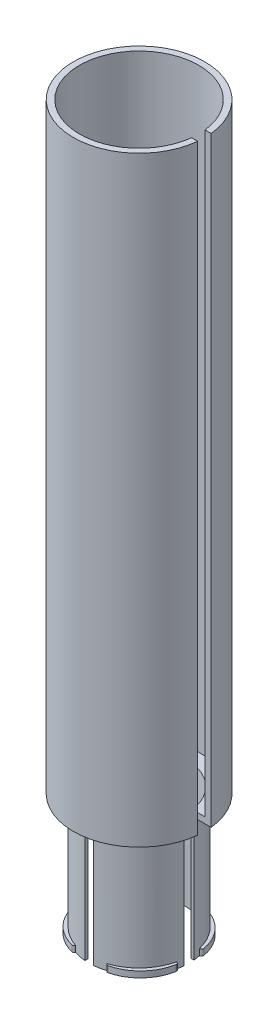
ISO-10303-21;
HEADER;
FILE_DESCRIPTION(('STEP AP214'),'2;1');
FILE_NAME('part.step','',(''),(''),'','','');
FILE_SCHEMA(('AUTOMOTIVE_DESIGN { 1 0 10303 214 1 1 1 1 }'));
ENDSEC;
DATA;
#1=APPLICATION_CONTEXT('core data for automotive mechanical design processes');
#2=APPLICATION_PROTOCOL_DEFINITION('international standard','automotive_design',2000,#1);
#3=PRODUCT_CONTEXT('',#1,'mechanical');
#4=PRODUCT('Part','Part','',(#3));
#5=PRODUCT_RELATED_PRODUCT_CATEGORY('part','',(#4));
#6=PRODUCT_DEFINITION_FORMATION('','',#4);
#7=PRODUCT_DEFINITION_CONTEXT('part definition',#1,'design');
#8=PRODUCT_DEFINITION('design','',#6,#7);
#9=PRODUCT_DEFINITION_SHAPE('','',#8);
#10=(LENGTH_UNIT() NAMED_UNIT(*) SI_UNIT(.MILLI.,.METRE.));
#11=(NAMED_UNIT(*) PLANE_ANGLE_UNIT() SI_UNIT($,.RADIAN.));
#12=(NAMED_UNIT(*) SI_UNIT($,.STERADIAN.) SOLID_ANGLE_UNIT());
#13=UNCERTAINTY_MEASURE_WITH_UNIT(LENGTH_MEASURE(1.E-05),#10,'distance_accuracy_value','');
#14=(GEOMETRIC_REPRESENTATION_CONTEXT(3) GLOBAL_UNCERTAINTY_ASSIGNED_CONTEXT((#13)) GLOBAL_UNIT_ASSIGNED_CONTEXT((#10,
#11,#12)) REPRESENTATION_CONTEXT('',''));
#15=CARTESIAN_POINT('',(0.,0.,0.));
#16=DIRECTION('',(0.,0.,1.));
#17=DIRECTION('',(1.,0.,0.));
#18=AXIS2_PLACEMENT_3D('',#15,#16,#17);
#19=CARTESIAN_POINT('',(0.,200.,0.));
#20=DIRECTION('',(0.,-1.,0.));
#21=DIRECTION('',(0.,0.,-1.));
#22=AXIS2_PLACEMENT_3D('',#19,#20,#21);
#23=CYLINDRICAL_SURFACE('',#22,19.59);
#24=DIRECTION('',(0.,-1.,0.));
#25=VECTOR('',#24,1.);
#26=CARTESIAN_POINT('',(19.4644896015333,200.,-2.21398838113535));
#27=LINE('',#26,#25);
#28=CARTESIAN_POINT('',(19.4644896015333,197.5,-2.21398838113535));
#29=VERTEX_POINT('',#28);
#30=CARTESIAN_POINT('',(19.4644896015333,2.,-2.21398838113535));
#31=VERTEX_POINT('',#30);
#32=EDGE_CURVE('E514',#29,#31,#27,.T.);
#33=ORIENTED_EDGE('',*,*,#32,.F.);
#34=CARTESIAN_POINT('',(0.,197.5,0.));
#35=DIRECTION('',(0.,1.,0.));
#36=DIRECTION('',(0.,0.,1.));
#37=AXIS2_PLACEMENT_3D('',#34,#35,#36);
#38=CIRCLE('',#37,19.59);
#39=CARTESIAN_POINT('',(19.4644896015333,197.5,2.21398838113535));
#40=VERTEX_POINT('',#39);
#41=EDGE_CURVE('E292',#29,#40,#38,.T.);
#42=ORIENTED_EDGE('',*,*,#41,.T.);
#43=DIRECTION('',(0.,-1.,0.));
#44=VECTOR('',#43,1.);
#45=CARTESIAN_POINT('',(19.4644896015333,200.,2.21398838113535));
#46=LINE('',#45,#44);
#47=CARTESIAN_POINT('',(19.4644896015333,2.,2.21398838113535));
#48=VERTEX_POINT('',#47);
#49=EDGE_CURVE('E289',#48,#40,#46,.F.);
#50=ORIENTED_EDGE('',*,*,#49,.F.);
#51=CARTESIAN_POINT('',(0.,2.,0.));
#52=DIRECTION('',(0.,1.,0.));
#53=DIRECTION('',(0.,0.,1.));
#54=AXIS2_PLACEMENT_3D('',#51,#52,#53);
#55=CIRCLE('',#54,19.59);
#56=EDGE_CURVE('E302',#31,#48,#55,.T.);
#57=ORIENTED_EDGE('',*,*,#56,.F.);
#58=EDGE_LOOP('',(#33,#42,#50,#57));
#59=FACE_BOUND('',#58,.T.);
#60=ADVANCED_FACE('F47',(#59),#23,.F.);
#61=CARTESIAN_POINT('',(15.,104.269834735047,2.21398838113535));
#62=DIRECTION('',(0.,0.,1.));
#63=DIRECTION('',(1.,0.,0.));
#64=AXIS2_PLACEMENT_3D('',#61,#62,#63);
#65=PLANE('',#64);
#66=DIRECTION('',(-1.,0.,0.));
#67=VECTOR('',#66,1.);
#68=CARTESIAN_POINT('',(15.,197.5,2.21398838113535));
#69=LINE('',#68,#67);
#70=CARTESIAN_POINT('',(21.4761811188162,197.5,2.21398838113535));
#71=VERTEX_POINT('',#70);
#72=EDGE_CURVE('E275',#71,#40,#69,.T.);
#73=ORIENTED_EDGE('',*,*,#72,.F.);
#74=DIRECTION('',(0.,-1.,0.));
#75=VECTOR('',#74,1.);
#76=CARTESIAN_POINT('',(21.4761811188162,200.,2.21398838113535));
#77=LINE('',#76,#75);
#78=CARTESIAN_POINT('',(21.4761811188162,0.,2.21398838113535));
#79=VERTEX_POINT('',#78);
#80=EDGE_CURVE('E287',#79,#71,#77,.F.);
#81=ORIENTED_EDGE('',*,*,#80,.F.);
#82=DIRECTION('',(1.,0.,0.));
#83=VECTOR('',#82,1.);
#84=CARTESIAN_POINT('',(15.,0.,2.21398838113535));
#85=LINE('',#84,#83);
#86=CARTESIAN_POINT('',(16.350787609415,0.,2.21398838113535));
#87=VERTEX_POINT('',#86);
#88=EDGE_CURVE('E520',#87,#79,#85,.T.);
#89=ORIENTED_EDGE('',*,*,#88,.F.);
#90=CARTESIAN_POINT('',(15.3410643518694,0.,2.21398838113535));
#91=VERTEX_POINT('',#90);
#92=EDGE_CURVE('E516',#91,#87,#85,.T.);
#93=ORIENTED_EDGE('',*,*,#92,.F.);
#94=DIRECTION('',(0.,-1.,0.));
#95=VECTOR('',#94,1.);
#96=CARTESIAN_POINT('',(15.3410643518694,22.,2.21398838113535));
#97=LINE('',#96,#95);
#98=CARTESIAN_POINT('',(15.3410643518694,2.,2.21398838113535));
#99=VERTEX_POINT('',#98);
#100=EDGE_CURVE('E490',#91,#99,#97,.F.);
#101=ORIENTED_EDGE('',*,*,#100,.T.);
#102=DIRECTION('',(1.,0.,0.));
#103=VECTOR('',#102,1.);
#104=CARTESIAN_POINT('',(0.,2.,2.21398838113535));
#105=LINE('',#104,#103);
#106=EDGE_CURVE('E315',#99,#48,#105,.T.);
#107=ORIENTED_EDGE('',*,*,#106,.T.);
#108=ORIENTED_EDGE('',*,*,#49,.T.);
#109=EDGE_LOOP('',(#73,#81,#89,#93,#101,#107,#108));
#110=FACE_BOUND('',#109,.T.);
#111=ADVANCED_FACE('F285',(#110),#65,.F.);
#112=CARTESIAN_POINT('',(15.,104.269834735047,-2.21398838113535));
#113=DIRECTION('',(0.,0.,-1.));
#114=DIRECTION('',(-1.,0.,0.));
#115=AXIS2_PLACEMENT_3D('',#112,#113,#114);
#116=PLANE('',#115);
#117=DIRECTION('',(1.,0.,0.));
#118=VECTOR('',#117,1.);
#119=CARTESIAN_POINT('',(15.,197.5,-2.21398838113535));
#120=LINE('',#119,#118);
#121=CARTESIAN_POINT('',(21.4761811188162,197.5,-2.21398838113535));
#122=VERTEX_POINT('',#121);
#123=EDGE_CURVE('E63',#29,#122,#120,.T.);
#124=ORIENTED_EDGE('',*,*,#123,.F.);
#125=ORIENTED_EDGE('',*,*,#32,.T.);
#126=DIRECTION('',(-1.,0.,0.));
#127=VECTOR('',#126,1.);
#128=CARTESIAN_POINT('',(0.,2.,-2.21398838113535));
#129=LINE('',#128,#127);
#130=CARTESIAN_POINT('',(15.3410643518694,2.,-2.21398838113535));
#131=VERTEX_POINT('',#130);
#132=EDGE_CURVE('E311',#31,#131,#129,.T.);
#133=ORIENTED_EDGE('',*,*,#132,.T.);
#134=DIRECTION('',(0.,-1.,0.));
#135=VECTOR('',#134,1.);
#136=CARTESIAN_POINT('',(15.3410643518694,22.,-2.21398838113535));
#137=LINE('',#136,#135);
#138=CARTESIAN_POINT('',(15.3410643518694,0.,-2.21398838113535));
#139=VERTEX_POINT('',#138);
#140=EDGE_CURVE('E485',#131,#139,#137,.T.);
#141=ORIENTED_EDGE('',*,*,#140,.T.);
#142=DIRECTION('',(1.,0.,0.));
#143=VECTOR('',#142,1.);
#144=CARTESIAN_POINT('',(15.,0.,-2.21398838113535));
#145=LINE('',#144,#143);
#146=CARTESIAN_POINT('',(16.350787609415,0.,-2.21398838113535));
#147=VERTEX_POINT('',#146);
#148=EDGE_CURVE('E510',#139,#147,#145,.T.);
#149=ORIENTED_EDGE('',*,*,#148,.T.);
#150=CARTESIAN_POINT('',(21.4761811188162,0.,-2.21398838113535));
#151=VERTEX_POINT('',#150);
#152=EDGE_CURVE('E515',#147,#151,#145,.T.);
#153=ORIENTED_EDGE('',*,*,#152,.T.);
#154=DIRECTION('',(0.,-1.,0.));
#155=VECTOR('',#154,1.);
#156=CARTESIAN_POINT('',(21.4761811188162,200.,-2.21398838113535));
#157=LINE('',#156,#155);
#158=EDGE_CURVE('E304',#122,#151,#157,.T.);
#159=ORIENTED_EDGE('',*,*,#158,.F.);
#160=EDGE_LOOP('',(#124,#125,#133,#141,#149,#153,#159));
#161=FACE_BOUND('',#160,.T.);
#162=ADVANCED_FACE('F526',(#161),#116,.F.);
#163=CARTESIAN_POINT('',(0.,200.,0.));
#164=DIRECTION('',(0.,-1.,0.));
#165=DIRECTION('',(0.,0.,-1.));
#166=AXIS2_PLACEMENT_3D('',#163,#164,#165);
#167=CYLINDRICAL_SURFACE('',#166,21.59);
#168=CARTESIAN_POINT('',(0.,197.5,0.));
#169=DIRECTION('',(0.,1.,0.));
#170=DIRECTION('',(0.,0.,1.));
#171=AXIS2_PLACEMENT_3D('',#168,#169,#170);
#172=CIRCLE('',#171,21.59);
#173=EDGE_CURVE('E272',#122,#71,#172,.T.);
#174=ORIENTED_EDGE('',*,*,#173,.F.);
#175=ORIENTED_EDGE('',*,*,#158,.T.);
#176=CARTESIAN_POINT('',(0.,0.,0.));
#177=DIRECTION('',(0.,1.,0.));
#178=DIRECTION('',(0.,0.,1.));
#179=AXIS2_PLACEMENT_3D('',#176,#177,#178);
#180=CIRCLE('',#179,21.59);
#181=EDGE_CURVE('E296',#151,#79,#180,.T.);
#182=ORIENTED_EDGE('',*,*,#181,.T.);
#183=ORIENTED_EDGE('',*,*,#80,.T.);
#184=EDGE_LOOP('',(#174,#175,#182,#183));
#185=FACE_BOUND('',#184,.T.);
#186=ADVANCED_FACE('F294',(#185),#167,.T.);
#187=CARTESIAN_POINT('',(0.,0.,0.));
#188=DIRECTION('',(0.,-1.,0.));
#189=DIRECTION('',(0.,0.,-1.));
#190=AXIS2_PLACEMENT_3D('',#187,#188,#189);
#191=PLANE('',#190);
#192=CARTESIAN_POINT('',(0.,0.,0.));
#193=DIRECTION('',(0.,-1.,0.));
#194=DIRECTION('',(0.,0.,-1.));
#195=AXIS2_PLACEMENT_3D('',#192,#193,#194);
#196=CIRCLE('',#195,16.5);
#197=CARTESIAN_POINT('',(16.4217809958449,0.,1.60471459285018));
#198=VERTEX_POINT('',#197);
#199=EDGE_CURVE('E497',#198,#87,#196,.T.);
#200=ORIENTED_EDGE('',*,*,#199,.F.);
#201=DIRECTION('',(1.,0.,0.));
#202=VECTOR('',#201,1.);
#203=CARTESIAN_POINT('',(14.2708113165108,0.,1.60471459285018));
#204=LINE('',#203,#202);
#205=CARTESIAN_POINT('',(15.4167081789691,0.,1.60471459285018));
#206=VERTEX_POINT('',#205);
#207=EDGE_CURVE('E408',#206,#198,#204,.T.);
#208=ORIENTED_EDGE('',*,*,#207,.F.);
#209=CARTESIAN_POINT('',(0.,0.,0.));
#210=DIRECTION('',(0.,-1.,0.));
#211=DIRECTION('',(0.,0.,-1.));
#212=AXIS2_PLACEMENT_3D('',#209,#210,#211);
#213=CIRCLE('',#212,15.5);
#214=EDGE_CURVE('E486',#206,#91,#213,.T.);
#215=ORIENTED_EDGE('',*,*,#214,.T.);
#216=ORIENTED_EDGE('',*,*,#92,.T.);
#217=EDGE_LOOP('',(#200,#208,#215,#216));
#218=FACE_BOUND('',#217,.T.);
#219=ADVANCED_FACE('F708',(#218),#191,.F.);
#220=CARTESIAN_POINT('',(0.,-40.,0.));
#221=DIRECTION('',(0.,1.,0.));
#222=DIRECTION('',(0.,0.,1.));
#223=AXIS2_PLACEMENT_3D('',#220,#221,#222);
#224=CYLINDRICAL_SURFACE('',#223,16.5);
#225=CARTESIAN_POINT('',(0.,-38.,0.));
#226=DIRECTION('',(0.,-1.,0.));
#227=DIRECTION('',(0.,0.,-1.));
#228=AXIS2_PLACEMENT_3D('',#225,#226,#227);
#229=CIRCLE('',#228,16.5);
#230=CARTESIAN_POINT('',(16.0583856503894,-38.,3.79186633511373));
#231=VERTEX_POINT('',#230);
#232=CARTESIAN_POINT('',(5.15649331727403,-38.,15.6735629857703));
#233=VERTEX_POINT('',#232);
#234=EDGE_CURVE('E11',#231,#233,#229,.T.);
#235=ORIENTED_EDGE('',*,*,#234,.F.);
#236=DIRECTION('',(0.,-1.,0.));
#237=VECTOR('',#236,1.);
#238=CARTESIAN_POINT('',(16.0583856503894,-39.,3.79186633511373));
#239=LINE('',#238,#237);
#240=CARTESIAN_POINT('',(16.0583856503894,-40.,3.79186633511373));
#241=VERTEX_POINT('',#240);
#242=EDGE_CURVE('E403',#231,#241,#239,.T.);
#243=ORIENTED_EDGE('',*,*,#242,.T.);
#244=CARTESIAN_POINT('',(0.,-40.,0.));
#245=DIRECTION('',(0.,-1.,0.));
#246=DIRECTION('',(0.,0.,-1.));
#247=AXIS2_PLACEMENT_3D('',#244,#245,#246);
#248=CIRCLE('',#247,16.5);
#249=CARTESIAN_POINT('',(16.4217809958449,-40.,1.60471459285018));
#250=VERTEX_POINT('',#249);
#251=EDGE_CURVE('E504',#250,#241,#248,.T.);
#252=ORIENTED_EDGE('',*,*,#251,.F.);
#253=DIRECTION('',(0.,1.,0.));
#254=VECTOR('',#253,1.);
#255=CARTESIAN_POINT('',(16.4217809958449,-40.,1.60471459285018));
#256=LINE('',#255,#254);
#257=EDGE_CURVE('E471',#250,#198,#256,.T.);
#258=ORIENTED_EDGE('',*,*,#257,.T.);
#259=ORIENTED_EDGE('',*,*,#199,.T.);
#260=CARTESIAN_POINT('',(1.3929264987986,0.,16.4410995912361));
#261=VERTEX_POINT('',#260);
#262=EDGE_CURVE('E323',#87,#261,#196,.T.);
#263=ORIENTED_EDGE('',*,*,#262,.T.);
#264=DIRECTION('',(0.,1.,0.));
#265=VECTOR('',#264,1.);
#266=CARTESIAN_POINT('',(1.3929264987986,-40.,16.4410995912361));
#267=LINE('',#266,#265);
#268=CARTESIAN_POINT('',(1.3929264987986,-40.,16.4410995912361));
#269=VERTEX_POINT('',#268);
#270=EDGE_CURVE('E463',#261,#269,#267,.F.);
#271=ORIENTED_EDGE('',*,*,#270,.T.);
#272=CARTESIAN_POINT('',(5.15649331727407,-40.,15.6735629857703));
#273=VERTEX_POINT('',#272);
#274=EDGE_CURVE('E503',#273,#269,#248,.T.);
#275=ORIENTED_EDGE('',*,*,#274,.F.);
#276=DIRECTION('',(0.,-1.,0.));
#277=VECTOR('',#276,1.);
#278=CARTESIAN_POINT('',(5.15649331727403,-39.,15.6735629857703));
#279=LINE('',#278,#277);
#280=EDGE_CURVE('E393',#273,#233,#279,.F.);
#281=ORIENTED_EDGE('',*,*,#280,.T.);
#282=EDGE_LOOP('',(#235,#243,#252,#258,#259,#263,#271,#275,#281));
#283=FACE_BOUND('',#282,.T.);
#284=ADVANCED_FACE('F718',(#283),#224,.T.);
#285=CARTESIAN_POINT('',(0.,-38.,0.));
#286=DIRECTION('',(0.,-1.,0.));
#287=DIRECTION('',(0.,0.,-1.));
#288=AXIS2_PLACEMENT_3D('',#285,#286,#287);
#289=CIRCLE('',#288,16.5);
#290=CARTESIAN_POINT('',(-16.0583856503894,-38.,-3.79186633511373));
#291=VERTEX_POINT('',#290);
#292=CARTESIAN_POINT('',(-5.15649331727403,-38.,-15.6735629857703));
#293=VERTEX_POINT('',#292);
#294=EDGE_CURVE('E56',#291,#293,#289,.T.);
#295=ORIENTED_EDGE('',*,*,#294,.F.);
#296=DIRECTION('',(0.,-1.,0.));
#297=VECTOR('',#296,1.);
#298=CARTESIAN_POINT('',(-16.0583856503894,-39.,-3.79186633511373));
#299=LINE('',#298,#297);
#300=CARTESIAN_POINT('',(-16.0583856503894,-40.,-3.79186633511373));
#301=VERTEX_POINT('',#300);
#302=EDGE_CURVE('E388',#291,#301,#299,.T.);
#303=ORIENTED_EDGE('',*,*,#302,.T.);
#304=CARTESIAN_POINT('',(-16.4219771304009,-40.,-1.60270618910367));
#305=VERTEX_POINT('',#304);
#306=EDGE_CURVE('E498',#305,#301,#248,.T.);
#307=ORIENTED_EDGE('',*,*,#306,.F.);
#308=DIRECTION('',(0.,1.,0.));
#309=VECTOR('',#308,1.);
#310=CARTESIAN_POINT('',(-16.4219771304009,-40.,-1.60270618910367));
#311=LINE('',#310,#309);
#312=CARTESIAN_POINT('',(-16.4219771304009,0.,-1.60270618910367));
#313=VERTEX_POINT('',#312);
#314=EDGE_CURVE('E415',#305,#313,#311,.T.);
#315=ORIENTED_EDGE('',*,*,#314,.T.);
#316=EDGE_CURVE('E318',#313,#147,#196,.T.);
#317=ORIENTED_EDGE('',*,*,#316,.T.);
#318=CARTESIAN_POINT('',(16.4219771304009,0.,-1.60270618910367));
#319=VERTEX_POINT('',#318);
#320=EDGE_CURVE('E505',#147,#319,#196,.T.);
#321=ORIENTED_EDGE('',*,*,#320,.T.);
#322=DIRECTION('',(0.,1.,0.));
#323=VECTOR('',#322,1.);
#324=CARTESIAN_POINT('',(16.4219771304009,-40.,-1.60270618910367));
#325=LINE('',#324,#323);
#326=CARTESIAN_POINT('',(16.4219771304009,-40.,-1.60270618910367));
#327=VERTEX_POINT('',#326);
#328=EDGE_CURVE('E467',#319,#327,#325,.F.);
#329=ORIENTED_EDGE('',*,*,#328,.T.);
#330=CARTESIAN_POINT('',(16.0583856503894,-40.,-3.79186633511364));
#331=VERTEX_POINT('',#330);
#332=EDGE_CURVE('E509',#331,#327,#248,.T.);
#333=ORIENTED_EDGE('',*,*,#332,.F.);
#334=DIRECTION('',(0.,-1.,0.));
#335=VECTOR('',#334,1.);
#336=CARTESIAN_POINT('',(16.0583856503894,-39.,-3.79186633511373));
#337=LINE('',#336,#335);
#338=CARTESIAN_POINT('',(16.0583856503894,-38.,-3.79186633511373));
#339=VERTEX_POINT('',#338);
#340=EDGE_CURVE('E389',#331,#339,#337,.F.);
#341=ORIENTED_EDGE('',*,*,#340,.T.);
#342=CARTESIAN_POINT('',(0.,-38.,0.));
#343=DIRECTION('',(0.,1.,0.));
#344=DIRECTION('',(0.,0.,1.));
#345=AXIS2_PLACEMENT_3D('',#342,#343,#344);
#346=CIRCLE('',#345,16.5);
#347=CARTESIAN_POINT('',(5.15649331727403,-38.,-15.6735629857703));
#348=VERTEX_POINT('',#347);
#349=EDGE_CURVE('E355',#339,#348,#346,.T.);
#350=ORIENTED_EDGE('',*,*,#349,.T.);
#351=DIRECTION('',(0.,-1.,0.));
#352=VECTOR('',#351,1.);
#353=CARTESIAN_POINT('',(5.15649331727403,-39.,-15.6735629857703));
#354=LINE('',#353,#352);
#355=CARTESIAN_POINT('',(5.15649331727403,-40.,-15.6735629857703));
#356=VERTEX_POINT('',#355);
#357=EDGE_CURVE('E396',#348,#356,#354,.T.);
#358=ORIENTED_EDGE('',*,*,#357,.T.);
#359=CARTESIAN_POINT('',(-5.15649331727407,-40.,-15.6735629857703));
#360=VERTEX_POINT('',#359);
#361=EDGE_CURVE('E386',#360,#356,#248,.T.);
#362=ORIENTED_EDGE('',*,*,#361,.F.);
#363=DIRECTION('',(0.,-1.,0.));
#364=VECTOR('',#363,1.);
#365=CARTESIAN_POINT('',(-5.15649331727403,-39.,-15.6735629857703));
#366=LINE('',#365,#364);
#367=EDGE_CURVE('E376',#360,#293,#366,.F.);
#368=ORIENTED_EDGE('',*,*,#367,.T.);
#369=EDGE_LOOP('',(#295,#303,#307,#315,#317,#321,#329,#333,#341,#350,#358,#362,#368));
#370=FACE_BOUND('',#369,.T.);
#371=ADVANCED_FACE('F383',(#370),#224,.T.);
#372=CARTESIAN_POINT('',(0.,-40.,0.));
#373=DIRECTION('',(0.,-1.,0.));
#374=DIRECTION('',(0.,0.,-1.));
#375=AXIS2_PLACEMENT_3D('',#372,#373,#374);
#376=PLANE('',#375);
#377=ORIENTED_EDGE('',*,*,#251,.T.);
#378=CARTESIAN_POINT('',(16.0773211304466,-40.,4.45014729328803));
#379=DIRECTION('',(0.,-1.,0.));
#380=DIRECTION('',(0.,0.,-1.));
#381=AXIS2_PLACEMENT_3D('',#378,#379,#380);
#382=CIRCLE('',#381,0.658553241811069);
#383=CARTESIAN_POINT('',(16.7263332990563,-40.,4.56184141711009));
#384=VERTEX_POINT('',#383);
#385=EDGE_CURVE('E635',#241,#384,#382,.T.);
#386=ORIENTED_EDGE('',*,*,#385,.T.);
#387=CARTESIAN_POINT('',(2.56279388179568,-40.,2.12431527824137));
#388=DIRECTION('',(0.,-1.,0.));
#389=DIRECTION('',(0.,0.,-1.));
#390=AXIS2_PLACEMENT_3D('',#387,#388,#389);
#391=CIRCLE('',#390,14.371756416735);
#392=CARTESIAN_POINT('',(5.93222646462539,-40.,16.0955108810425));
#393=VERTEX_POINT('',#392);
#394=EDGE_CURVE('E638',#384,#393,#391,.T.);
#395=ORIENTED_EDGE('',*,*,#394,.T.);
#396=CARTESIAN_POINT('',(5.77782983514296,-40.,15.4553124328217));
#397=DIRECTION('',(0.,-1.,0.));
#398=DIRECTION('',(0.,0.,-1.));
#399=AXIS2_PLACEMENT_3D('',#396,#397,#398);
#400=CIRCLE('',#399,0.658553241811068);
#401=EDGE_CURVE('E71',#393,#273,#400,.T.);
#402=ORIENTED_EDGE('',*,*,#401,.T.);
#403=ORIENTED_EDGE('',*,*,#274,.T.);
#404=DIRECTION('',(0.,0.,-1.));
#405=VECTOR('',#404,1.);
#406=CARTESIAN_POINT('',(1.3929264987986,-40.,14.1994144824118));
#407=LINE('',#406,#405);
#408=CARTESIAN_POINT('',(1.3929264987986,-40.,15.4372845983011));
#409=VERTEX_POINT('',#408);
#410=EDGE_CURVE('E427',#269,#409,#407,.T.);
#411=ORIENTED_EDGE('',*,*,#410,.T.);
#412=CARTESIAN_POINT('',(0.,-40.,0.));
#413=DIRECTION('',(0.,-1.,0.));
#414=DIRECTION('',(0.,0.,-1.));
#415=AXIS2_PLACEMENT_3D('',#412,#413,#414);
#416=CIRCLE('',#415,15.5);
#417=CARTESIAN_POINT('',(15.4167081789691,-40.,1.60471459285018));
#418=VERTEX_POINT('',#417);
#419=EDGE_CURVE('E480',#418,#409,#416,.T.);
#420=ORIENTED_EDGE('',*,*,#419,.F.);
#421=DIRECTION('',(1.,0.,0.));
#422=VECTOR('',#421,1.);
#423=CARTESIAN_POINT('',(14.2708113165108,-40.,1.60471459285018));
#424=LINE('',#423,#422);
#425=EDGE_CURVE('E416',#418,#250,#424,.T.);
#426=ORIENTED_EDGE('',*,*,#425,.T.);
#427=EDGE_LOOP('',(#377,#386,#395,#402,#403,#411,#420,#426));
#428=FACE_BOUND('',#427,.T.);
#429=ADVANCED_FACE('F723',(#428),#376,.T.);
#430=ORIENTED_EDGE('',*,*,#306,.T.);
#431=CARTESIAN_POINT('',(-16.0773211304466,-40.,-4.45014729328803));
#432=DIRECTION('',(0.,-1.,0.));
#433=DIRECTION('',(0.,0.,-1.));
#434=AXIS2_PLACEMENT_3D('',#431,#432,#433);
#435=CIRCLE('',#434,0.658553241811069);
#436=CARTESIAN_POINT('',(-16.7263332990563,-40.,-4.56184141711008));
#437=VERTEX_POINT('',#436);
#438=EDGE_CURVE('E577',#301,#437,#435,.T.);
#439=ORIENTED_EDGE('',*,*,#438,.T.);
#440=CARTESIAN_POINT('',(-2.56279388179568,-40.,-2.12431527824137));
#441=DIRECTION('',(0.,-1.,0.));
#442=DIRECTION('',(0.,0.,-1.));
#443=AXIS2_PLACEMENT_3D('',#440,#441,#442);
#444=CIRCLE('',#443,14.371756416735);
#445=CARTESIAN_POINT('',(-5.9322264646254,-40.,-16.0955108810425));
#446=VERTEX_POINT('',#445);
#447=EDGE_CURVE('E582',#437,#446,#444,.T.);
#448=ORIENTED_EDGE('',*,*,#447,.T.);
#449=CARTESIAN_POINT('',(-5.77782983514296,-40.,-15.4553124328217));
#450=DIRECTION('',(0.,-1.,0.));
#451=DIRECTION('',(0.,0.,-1.));
#452=AXIS2_PLACEMENT_3D('',#449,#450,#451);
#453=CIRCLE('',#452,0.658553241811068);
#454=EDGE_CURVE('E588',#446,#360,#453,.T.);
#455=ORIENTED_EDGE('',*,*,#454,.T.);
#456=ORIENTED_EDGE('',*,*,#361,.T.);
#457=CARTESIAN_POINT('',(5.77782983514296,-40.,-15.4553124328217));
#458=DIRECTION('',(0.,-1.,0.));
#459=DIRECTION('',(0.,0.,1.));
#460=AXIS2_PLACEMENT_3D('',#457,#458,#459);
#461=CIRCLE('',#460,0.658553241811068);
#462=CARTESIAN_POINT('',(5.93222646462539,-40.,-16.0955108810425));
#463=VERTEX_POINT('',#462);
#464=EDGE_CURVE('E663',#356,#463,#461,.T.);
#465=ORIENTED_EDGE('',*,*,#464,.T.);
#466=CARTESIAN_POINT('',(2.56279388179568,-40.,-2.12431527824137));
#467=DIRECTION('',(0.,-1.,0.));
#468=DIRECTION('',(0.,0.,1.));
#469=AXIS2_PLACEMENT_3D('',#466,#467,#468);
#470=CIRCLE('',#469,14.371756416735);
#471=CARTESIAN_POINT('',(16.7263332990563,-40.,-4.56184141711009));
#472=VERTEX_POINT('',#471);
#473=EDGE_CURVE('E676',#463,#472,#470,.T.);
#474=ORIENTED_EDGE('',*,*,#473,.T.);
#475=CARTESIAN_POINT('',(16.0773211304466,-40.,-4.45014729328803));
#476=DIRECTION('',(0.,-1.,0.));
#477=DIRECTION('',(0.,0.,1.));
#478=AXIS2_PLACEMENT_3D('',#475,#476,#477);
#479=CIRCLE('',#478,0.658553241811069);
#480=EDGE_CURVE('E559',#472,#331,#479,.T.);
#481=ORIENTED_EDGE('',*,*,#480,.T.);
#482=ORIENTED_EDGE('',*,*,#332,.T.);
#483=DIRECTION('',(-1.,0.,0.));
#484=VECTOR('',#483,1.);
#485=CARTESIAN_POINT('',(14.2708113165108,-40.,-1.60270618910367));
#486=LINE('',#485,#484);
#487=CARTESIAN_POINT('',(15.4169171001017,-40.,-1.60270618910367));
#488=VERTEX_POINT('',#487);
#489=EDGE_CURVE('E412',#327,#488,#486,.T.);
#490=ORIENTED_EDGE('',*,*,#489,.T.);
#491=CARTESIAN_POINT('',(-15.4169171001017,-40.,-1.60270618910367));
#492=VERTEX_POINT('',#491);
#493=EDGE_CURVE('E475',#492,#488,#416,.T.);
#494=ORIENTED_EDGE('',*,*,#493,.F.);
#495=DIRECTION('',(-1.,0.,0.));
#496=VECTOR('',#495,1.);
#497=CARTESIAN_POINT('',(-14.2708113165108,-40.,-1.60270618910367));
#498=LINE('',#497,#496);
#499=EDGE_CURVE('E443',#492,#305,#498,.T.);
#500=ORIENTED_EDGE('',*,*,#499,.T.);
#501=EDGE_LOOP('',(#430,#439,#448,#455,#456,#465,#474,#481,#482,#490,#494,#500));
#502=FACE_BOUND('',#501,.T.);
#503=ADVANCED_FACE('F555',(#502),#376,.T.);
#504=CARTESIAN_POINT('',(0.,2.,0.));
#505=DIRECTION('',(0.,1.,0.));
#506=DIRECTION('',(0.,0.,1.));
#507=AXIS2_PLACEMENT_3D('',#504,#505,#506);
#508=PLANE('',#507);
#509=CARTESIAN_POINT('',(0.,2.,0.));
#510=DIRECTION('',(0.,1.,0.));
#511=DIRECTION('',(0.,0.,1.));
#512=AXIS2_PLACEMENT_3D('',#509,#510,#511);
#513=CIRCLE('',#512,15.5);
#514=EDGE_CURVE('E494',#131,#99,#513,.T.);
#515=ORIENTED_EDGE('',*,*,#514,.F.);
#516=ORIENTED_EDGE('',*,*,#132,.F.);
#517=ORIENTED_EDGE('',*,*,#56,.T.);
#518=ORIENTED_EDGE('',*,*,#106,.F.);
#519=EDGE_LOOP('',(#515,#516,#517,#518));
#520=FACE_BOUND('',#519,.T.);
#521=ADVANCED_FACE('F49',(#520),#508,.T.);
#522=CARTESIAN_POINT('',(0.,0.,0.));
#523=DIRECTION('',(0.,1.,0.));
#524=DIRECTION('',(0.,0.,1.));
#525=AXIS2_PLACEMENT_3D('',#522,#523,#524);
#526=PLANE('',#525);
#527=ORIENTED_EDGE('',*,*,#88,.T.);
#528=ORIENTED_EDGE('',*,*,#181,.F.);
#529=ORIENTED_EDGE('',*,*,#152,.F.);
#530=ORIENTED_EDGE('',*,*,#316,.F.);
#531=DIRECTION('',(-1.,0.,0.));
#532=VECTOR('',#531,1.);
#533=CARTESIAN_POINT('',(-14.2708113165108,0.,-1.60270618910367));
#534=LINE('',#533,#532);
#535=CARTESIAN_POINT('',(-15.4169171001017,0.,-1.60270618910367));
#536=VERTEX_POINT('',#535);
#537=EDGE_CURVE('E435',#536,#313,#534,.T.);
#538=ORIENTED_EDGE('',*,*,#537,.F.);
#539=CARTESIAN_POINT('',(0.,0.,0.));
#540=DIRECTION('',(0.,-1.,0.));
#541=DIRECTION('',(0.,0.,-1.));
#542=AXIS2_PLACEMENT_3D('',#539,#540,#541);
#543=CIRCLE('',#542,15.5);
#544=CARTESIAN_POINT('',(-15.4167081789691,0.,1.60471459285018));
#545=VERTEX_POINT('',#544);
#546=EDGE_CURVE('E319',#536,#545,#543,.F.);
#547=ORIENTED_EDGE('',*,*,#546,.T.);
#548=DIRECTION('',(1.,0.,0.));
#549=VECTOR('',#548,1.);
#550=CARTESIAN_POINT('',(-14.2708113165108,0.,1.60471459285018));
#551=LINE('',#550,#549);
#552=CARTESIAN_POINT('',(-16.4217809958449,0.,1.60471459285018));
#553=VERTEX_POINT('',#552);
#554=EDGE_CURVE('E439',#553,#545,#551,.T.);
#555=ORIENTED_EDGE('',*,*,#554,.F.);
#556=CARTESIAN_POINT('',(-1.36571454710606,0.,16.4433823702979));
#557=VERTEX_POINT('',#556);
#558=EDGE_CURVE('E784',#557,#553,#196,.T.);
#559=ORIENTED_EDGE('',*,*,#558,.F.);
#560=DIRECTION('',(0.,0.,1.));
#561=VECTOR('',#560,1.);
#562=CARTESIAN_POINT('',(-1.36571454710606,0.,14.1994144824118));
#563=LINE('',#562,#561);
#564=CARTESIAN_POINT('',(-1.36571454710606,0.,15.4397157932335));
#565=VERTEX_POINT('',#564);
#566=EDGE_CURVE('E424',#565,#557,#563,.T.);
#567=ORIENTED_EDGE('',*,*,#566,.F.);
#568=CARTESIAN_POINT('',(0.,0.,0.));
#569=DIRECTION('',(0.,1.,0.));
#570=DIRECTION('',(0.,0.,1.));
#571=AXIS2_PLACEMENT_3D('',#568,#569,#570);
#572=CIRCLE('',#571,15.5);
#573=CARTESIAN_POINT('',(1.3929264987986,0.,15.4372845983011));
#574=VERTEX_POINT('',#573);
#575=EDGE_CURVE('E331',#574,#565,#572,.F.);
#576=ORIENTED_EDGE('',*,*,#575,.F.);
#577=DIRECTION('',(0.,0.,-1.));
#578=VECTOR('',#577,1.);
#579=CARTESIAN_POINT('',(1.3929264987986,0.,14.1994144824118));
#580=LINE('',#579,#578);
#581=EDGE_CURVE('E420',#261,#574,#580,.T.);
#582=ORIENTED_EDGE('',*,*,#581,.F.);
#583=ORIENTED_EDGE('',*,*,#262,.F.);
#584=EDGE_LOOP('',(#527,#528,#529,#530,#538,#547,#555,#559,#567,#576,#582,#583));
#585=FACE_BOUND('',#584,.T.);
#586=ADVANCED_FACE('F532',(#585),#526,.F.);
#587=CARTESIAN_POINT('',(15.4169171001017,0.,-1.60270618910367));
#588=VERTEX_POINT('',#587);
#589=EDGE_CURVE('E481',#139,#588,#213,.T.);
#590=ORIENTED_EDGE('',*,*,#589,.T.);
#591=DIRECTION('',(-1.,0.,0.));
#592=VECTOR('',#591,1.);
#593=CARTESIAN_POINT('',(14.2708113165108,0.,-1.60270618910367));
#594=LINE('',#593,#592);
#595=EDGE_CURVE('E411',#319,#588,#594,.T.);
#596=ORIENTED_EDGE('',*,*,#595,.F.);
#597=ORIENTED_EDGE('',*,*,#320,.F.);
#598=ORIENTED_EDGE('',*,*,#148,.F.);
#599=EDGE_LOOP('',(#590,#596,#597,#598));
#600=FACE_BOUND('',#599,.T.);
#601=ADVANCED_FACE('F565',(#600),#191,.F.);
#602=CARTESIAN_POINT('',(-16.0583856503894,-40.,3.79186633511364));
#603=VERTEX_POINT('',#602);
#604=CARTESIAN_POINT('',(-16.4217809958449,-40.,1.60471459285018));
#605=VERTEX_POINT('',#604);
#606=EDGE_CURVE('E502',#603,#605,#248,.T.);
#607=ORIENTED_EDGE('',*,*,#606,.F.);
#608=DIRECTION('',(0.,-1.,0.));
#609=VECTOR('',#608,1.);
#610=CARTESIAN_POINT('',(-16.0583856503894,-39.,3.79186633511373));
#611=LINE('',#610,#609);
#612=CARTESIAN_POINT('',(-16.0583856503894,-38.,3.79186633511373));
#613=VERTEX_POINT('',#612);
#614=EDGE_CURVE('E653',#603,#613,#611,.F.);
#615=ORIENTED_EDGE('',*,*,#614,.T.);
#616=CARTESIAN_POINT('',(0.,-38.,0.));
#617=DIRECTION('',(0.,1.,0.));
#618=DIRECTION('',(0.,0.,1.));
#619=AXIS2_PLACEMENT_3D('',#616,#617,#618);
#620=CIRCLE('',#619,16.5);
#621=CARTESIAN_POINT('',(-5.15649331727403,-38.,15.6735629857703));
#622=VERTEX_POINT('',#621);
#623=EDGE_CURVE('E351',#613,#622,#620,.T.);
#624=ORIENTED_EDGE('',*,*,#623,.T.);
#625=DIRECTION('',(0.,-1.,0.));
#626=VECTOR('',#625,1.);
#627=CARTESIAN_POINT('',(-5.15649331727403,-39.,15.6735629857703));
#628=LINE('',#627,#626);
#629=CARTESIAN_POINT('',(-5.15649331727403,-40.,15.6735629857703));
#630=VERTEX_POINT('',#629);
#631=EDGE_CURVE('E646',#622,#630,#628,.T.);
#632=ORIENTED_EDGE('',*,*,#631,.T.);
#633=CARTESIAN_POINT('',(-1.36571454710606,-40.,16.4433823702979));
#634=VERTEX_POINT('',#633);
#635=EDGE_CURVE('E540',#634,#630,#248,.T.);
#636=ORIENTED_EDGE('',*,*,#635,.F.);
#637=DIRECTION('',(0.,1.,0.));
#638=VECTOR('',#637,1.);
#639=CARTESIAN_POINT('',(-1.36571454710606,-40.,16.4433823702979));
#640=LINE('',#639,#638);
#641=EDGE_CURVE('E459',#634,#557,#640,.T.);
#642=ORIENTED_EDGE('',*,*,#641,.T.);
#643=ORIENTED_EDGE('',*,*,#558,.T.);
#644=DIRECTION('',(0.,1.,0.));
#645=VECTOR('',#644,1.);
#646=CARTESIAN_POINT('',(-16.4217809958449,-40.,1.60471459285018));
#647=LINE('',#646,#645);
#648=EDGE_CURVE('E455',#553,#605,#647,.F.);
#649=ORIENTED_EDGE('',*,*,#648,.T.);
#650=EDGE_LOOP('',(#607,#615,#624,#632,#636,#642,#643,#649));
#651=FACE_BOUND('',#650,.T.);
#652=ADVANCED_FACE('F713',(#651),#224,.T.);
#653=ORIENTED_EDGE('',*,*,#635,.T.);
#654=CARTESIAN_POINT('',(-5.77782983514296,-40.,15.4553124328217));
#655=DIRECTION('',(0.,-1.,0.));
#656=DIRECTION('',(0.,0.,1.));
#657=AXIS2_PLACEMENT_3D('',#654,#655,#656);
#658=CIRCLE('',#657,0.658553241811068);
#659=CARTESIAN_POINT('',(-5.9322264646254,-40.,16.0955108810425));
#660=VERTEX_POINT('',#659);
#661=EDGE_CURVE('E607',#630,#660,#658,.T.);
#662=ORIENTED_EDGE('',*,*,#661,.T.);
#663=CARTESIAN_POINT('',(-2.56279388179568,-40.,2.12431527824137));
#664=DIRECTION('',(0.,-1.,0.));
#665=DIRECTION('',(0.,0.,1.));
#666=AXIS2_PLACEMENT_3D('',#663,#664,#665);
#667=CIRCLE('',#666,14.371756416735);
#668=CARTESIAN_POINT('',(-16.7263332990563,-40.,4.56184141711008));
#669=VERTEX_POINT('',#668);
#670=EDGE_CURVE('E603',#660,#669,#667,.T.);
#671=ORIENTED_EDGE('',*,*,#670,.T.);
#672=CARTESIAN_POINT('',(-16.0773211304466,-40.,4.45014729328803));
#673=DIRECTION('',(0.,-1.,0.));
#674=DIRECTION('',(0.,0.,1.));
#675=AXIS2_PLACEMENT_3D('',#672,#673,#674);
#676=CIRCLE('',#675,0.658553241811069);
#677=EDGE_CURVE('E611',#669,#603,#676,.T.);
#678=ORIENTED_EDGE('',*,*,#677,.T.);
#679=ORIENTED_EDGE('',*,*,#606,.T.);
#680=DIRECTION('',(1.,0.,0.));
#681=VECTOR('',#680,1.);
#682=CARTESIAN_POINT('',(-14.2708113165108,-40.,1.60471459285018));
#683=LINE('',#682,#681);
#684=CARTESIAN_POINT('',(-15.4167081789691,-40.,1.60471459285018));
#685=VERTEX_POINT('',#684);
#686=EDGE_CURVE('E407',#605,#685,#683,.T.);
#687=ORIENTED_EDGE('',*,*,#686,.T.);
#688=CARTESIAN_POINT('',(-1.36571454710606,-40.,15.4397157932335));
#689=VERTEX_POINT('',#688);
#690=EDGE_CURVE('E479',#689,#685,#416,.T.);
#691=ORIENTED_EDGE('',*,*,#690,.F.);
#692=DIRECTION('',(0.,0.,1.));
#693=VECTOR('',#692,1.);
#694=CARTESIAN_POINT('',(-1.36571454710606,-40.,14.1994144824118));
#695=LINE('',#694,#693);
#696=EDGE_CURVE('E431',#689,#634,#695,.T.);
#697=ORIENTED_EDGE('',*,*,#696,.T.);
#698=EDGE_LOOP('',(#653,#662,#671,#678,#679,#687,#691,#697));
#699=FACE_BOUND('',#698,.T.);
#700=ADVANCED_FACE('F716',(#699),#376,.T.);
#701=CARTESIAN_POINT('',(0.,22.,0.));
#702=DIRECTION('',(0.,-1.,0.));
#703=DIRECTION('',(0.,0.,-1.));
#704=AXIS2_PLACEMENT_3D('',#701,#702,#703);
#705=CYLINDRICAL_SURFACE('',#704,15.5);
#706=ORIENTED_EDGE('',*,*,#214,.F.);
#707=DIRECTION('',(0.,-1.,0.));
#708=VECTOR('',#707,1.);
#709=CARTESIAN_POINT('',(15.4167081789691,22.,1.60471459285018));
#710=LINE('',#709,#708);
#711=EDGE_CURVE('E347',#206,#418,#710,.T.);
#712=ORIENTED_EDGE('',*,*,#711,.T.);
#713=ORIENTED_EDGE('',*,*,#419,.T.);
#714=DIRECTION('',(0.,-1.,0.));
#715=VECTOR('',#714,1.);
#716=CARTESIAN_POINT('',(1.3929264987986,22.,15.4372845983011));
#717=LINE('',#716,#715);
#718=EDGE_CURVE('E339',#409,#574,#717,.F.);
#719=ORIENTED_EDGE('',*,*,#718,.T.);
#720=ORIENTED_EDGE('',*,*,#575,.T.);
#721=DIRECTION('',(0.,-1.,0.));
#722=VECTOR('',#721,1.);
#723=CARTESIAN_POINT('',(-1.36571454710606,22.,15.4397157932335));
#724=LINE('',#723,#722);
#725=EDGE_CURVE('E335',#565,#689,#724,.T.);
#726=ORIENTED_EDGE('',*,*,#725,.T.);
#727=ORIENTED_EDGE('',*,*,#690,.T.);
#728=DIRECTION('',(0.,-1.,0.));
#729=VECTOR('',#728,1.);
#730=CARTESIAN_POINT('',(-15.4167081789691,22.,1.60471459285018));
#731=LINE('',#730,#729);
#732=EDGE_CURVE('E327',#685,#545,#731,.F.);
#733=ORIENTED_EDGE('',*,*,#732,.T.);
#734=ORIENTED_EDGE('',*,*,#546,.F.);
#735=DIRECTION('',(0.,-1.,0.));
#736=VECTOR('',#735,1.);
#737=CARTESIAN_POINT('',(-15.4169171001017,22.,-1.60270618910367));
#738=LINE('',#737,#736);
#739=EDGE_CURVE('E322',#536,#492,#738,.T.);
#740=ORIENTED_EDGE('',*,*,#739,.T.);
#741=ORIENTED_EDGE('',*,*,#493,.T.);
#742=DIRECTION('',(0.,-1.,0.));
#743=VECTOR('',#742,1.);
#744=CARTESIAN_POINT('',(15.4169171001017,22.,-1.60270618910367));
#745=LINE('',#744,#743);
#746=EDGE_CURVE('E343',#488,#588,#745,.F.);
#747=ORIENTED_EDGE('',*,*,#746,.T.);
#748=ORIENTED_EDGE('',*,*,#589,.F.);
#749=ORIENTED_EDGE('',*,*,#140,.F.);
#750=ORIENTED_EDGE('',*,*,#514,.T.);
#751=ORIENTED_EDGE('',*,*,#100,.F.);
#752=EDGE_LOOP('',(#706,#712,#713,#719,#720,#726,#727,#733,#734,#740,#741,#747,#748,#749,#750,#751));
#753=FACE_BOUND('',#752,.T.);
#754=ADVANCED_FACE('F568',(#753),#705,.F.);
#755=CARTESIAN_POINT('',(-14.2708113165108,-40.,1.60471459285018));
#756=DIRECTION('',(0.,0.,1.));
#757=DIRECTION('',(1.,0.,0.));
#758=AXIS2_PLACEMENT_3D('',#755,#756,#757);
#759=PLANE('',#758);
#760=ORIENTED_EDGE('',*,*,#554,.T.);
#761=ORIENTED_EDGE('',*,*,#732,.F.);
#762=ORIENTED_EDGE('',*,*,#686,.F.);
#763=ORIENTED_EDGE('',*,*,#648,.F.);
#764=EDGE_LOOP('',(#760,#761,#762,#763));
#765=FACE_BOUND('',#764,.T.);
#766=ADVANCED_FACE('F726',(#765),#759,.F.);
#767=CARTESIAN_POINT('',(-14.2708113165108,-40.,-1.60270618910367));
#768=DIRECTION('',(0.,0.,-1.));
#769=DIRECTION('',(-1.,0.,0.));
#770=AXIS2_PLACEMENT_3D('',#767,#768,#769);
#771=PLANE('',#770);
#772=ORIENTED_EDGE('',*,*,#499,.F.);
#773=ORIENTED_EDGE('',*,*,#739,.F.);
#774=ORIENTED_EDGE('',*,*,#537,.T.);
#775=ORIENTED_EDGE('',*,*,#314,.F.);
#776=EDGE_LOOP('',(#772,#773,#774,#775));
#777=FACE_BOUND('',#776,.T.);
#778=ADVANCED_FACE('F729',(#777),#771,.F.);
#779=CARTESIAN_POINT('',(1.3929264987986,-40.,14.1994144824118));
#780=DIRECTION('',(1.,0.,0.));
#781=DIRECTION('',(0.,0.,-1.));
#782=AXIS2_PLACEMENT_3D('',#779,#780,#781);
#783=PLANE('',#782);
#784=ORIENTED_EDGE('',*,*,#581,.T.);
#785=ORIENTED_EDGE('',*,*,#718,.F.);
#786=ORIENTED_EDGE('',*,*,#410,.F.);
#787=ORIENTED_EDGE('',*,*,#270,.F.);
#788=EDGE_LOOP('',(#784,#785,#786,#787));
#789=FACE_BOUND('',#788,.T.);
#790=ADVANCED_FACE('F733',(#789),#783,.F.);
#791=CARTESIAN_POINT('',(-1.36571454710606,-40.,14.1994144824118));
#792=DIRECTION('',(-1.,0.,0.));
#793=DIRECTION('',(0.,0.,1.));
#794=AXIS2_PLACEMENT_3D('',#791,#792,#793);
#795=PLANE('',#794);
#796=ORIENTED_EDGE('',*,*,#696,.F.);
#797=ORIENTED_EDGE('',*,*,#725,.F.);
#798=ORIENTED_EDGE('',*,*,#566,.T.);
#799=ORIENTED_EDGE('',*,*,#641,.F.);
#800=EDGE_LOOP('',(#796,#797,#798,#799));
#801=FACE_BOUND('',#800,.T.);
#802=ADVANCED_FACE('F734',(#801),#795,.F.);
#803=CARTESIAN_POINT('',(14.2708113165108,-40.,-1.60270618910367));
#804=DIRECTION('',(0.,0.,-1.));
#805=DIRECTION('',(-1.,0.,0.));
#806=AXIS2_PLACEMENT_3D('',#803,#804,#805);
#807=PLANE('',#806);
#808=ORIENTED_EDGE('',*,*,#595,.T.);
#809=ORIENTED_EDGE('',*,*,#746,.F.);
#810=ORIENTED_EDGE('',*,*,#489,.F.);
#811=ORIENTED_EDGE('',*,*,#328,.F.);
#812=EDGE_LOOP('',(#808,#809,#810,#811));
#813=FACE_BOUND('',#812,.T.);
#814=ADVANCED_FACE('F562',(#813),#807,.F.);
#815=CARTESIAN_POINT('',(14.2708113165108,-40.,1.60471459285018));
#816=DIRECTION('',(0.,0.,1.));
#817=DIRECTION('',(1.,0.,0.));
#818=AXIS2_PLACEMENT_3D('',#815,#816,#817);
#819=PLANE('',#818);
#820=ORIENTED_EDGE('',*,*,#425,.F.);
#821=ORIENTED_EDGE('',*,*,#711,.F.);
#822=ORIENTED_EDGE('',*,*,#207,.T.);
#823=ORIENTED_EDGE('',*,*,#257,.F.);
#824=EDGE_LOOP('',(#820,#821,#822,#823));
#825=FACE_BOUND('',#824,.T.);
#826=ADVANCED_FACE('F741',(#825),#819,.F.);
#827=CARTESIAN_POINT('',(-16.0773211304466,-38.,4.45014729328803));
#828=DIRECTION('',(0.,-1.,0.));
#829=DIRECTION('',(0.,0.,-1.));
#830=AXIS2_PLACEMENT_3D('',#827,#828,#829);
#831=CYLINDRICAL_SURFACE('',#830,0.658553241811069);
#832=ORIENTED_EDGE('',*,*,#614,.F.);
#833=ORIENTED_EDGE('',*,*,#677,.F.);
#834=DIRECTION('',(0.,-1.,0.));
#835=VECTOR('',#834,1.);
#836=CARTESIAN_POINT('',(-16.7263332990563,-38.,4.56184141711008));
#837=LINE('',#836,#835);
#838=CARTESIAN_POINT('',(-16.7263332990563,-38.,4.56184141711008));
#839=VERTEX_POINT('',#838);
#840=EDGE_CURVE('E291',#839,#669,#837,.T.);
#841=ORIENTED_EDGE('',*,*,#840,.F.);
#842=CARTESIAN_POINT('',(-16.0773211304466,-38.,4.45014729328803));
#843=DIRECTION('',(0.,-1.,0.));
#844=DIRECTION('',(0.,0.,1.));
#845=AXIS2_PLACEMENT_3D('',#842,#843,#844);
#846=CIRCLE('',#845,0.658553241811069);
#847=EDGE_CURVE('E608',#839,#613,#846,.T.);
#848=ORIENTED_EDGE('',*,*,#847,.T.);
#849=EDGE_LOOP('',(#832,#833,#841,#848));
#850=FACE_BOUND('',#849,.T.);
#851=ADVANCED_FACE('F744',(#850),#831,.T.);
#852=CARTESIAN_POINT('',(-5.77782983514296,-38.,15.4553124328217));
#853=DIRECTION('',(0.,-1.,0.));
#854=DIRECTION('',(0.,0.,-1.));
#855=AXIS2_PLACEMENT_3D('',#852,#853,#854);
#856=CYLINDRICAL_SURFACE('',#855,0.658553241811068);
#857=ORIENTED_EDGE('',*,*,#631,.F.);
#858=CARTESIAN_POINT('',(-5.77782983514296,-38.,15.4553124328217));
#859=DIRECTION('',(0.,-1.,0.));
#860=DIRECTION('',(0.,0.,1.));
#861=AXIS2_PLACEMENT_3D('',#858,#859,#860);
#862=CIRCLE('',#861,0.658553241811068);
#863=CARTESIAN_POINT('',(-5.9322264646254,-38.,16.0955108810425));
#864=VERTEX_POINT('',#863);
#865=EDGE_CURVE('E617',#622,#864,#862,.T.);
#866=ORIENTED_EDGE('',*,*,#865,.T.);
#867=DIRECTION('',(0.,-1.,0.));
#868=VECTOR('',#867,1.);
#869=CARTESIAN_POINT('',(-5.9322264646254,-38.,16.0955108810425));
#870=LINE('',#869,#868);
#871=EDGE_CURVE('E596',#864,#660,#870,.T.);
#872=ORIENTED_EDGE('',*,*,#871,.T.);
#873=ORIENTED_EDGE('',*,*,#661,.F.);
#874=EDGE_LOOP('',(#857,#866,#872,#873));
#875=FACE_BOUND('',#874,.T.);
#876=ADVANCED_FACE('F770',(#875),#856,.T.);
#877=CARTESIAN_POINT('',(-2.56279388179568,-38.,2.12431527824137));
#878=DIRECTION('',(0.,-1.,0.));
#879=DIRECTION('',(0.,0.,-1.));
#880=AXIS2_PLACEMENT_3D('',#877,#878,#879);
#881=CYLINDRICAL_SURFACE('',#880,14.371756416735);
#882=ORIENTED_EDGE('',*,*,#670,.F.);
#883=ORIENTED_EDGE('',*,*,#871,.F.);
#884=CARTESIAN_POINT('',(-2.56279388179568,-38.,2.12431527824137));
#885=DIRECTION('',(0.,-1.,0.));
#886=DIRECTION('',(0.,0.,1.));
#887=AXIS2_PLACEMENT_3D('',#884,#885,#886);
#888=CIRCLE('',#887,14.371756416735);
#889=EDGE_CURVE('E600',#864,#839,#888,.T.);
#890=ORIENTED_EDGE('',*,*,#889,.T.);
#891=ORIENTED_EDGE('',*,*,#840,.T.);
#892=EDGE_LOOP('',(#882,#883,#890,#891));
#893=FACE_BOUND('',#892,.T.);
#894=ADVANCED_FACE('F766',(#893),#881,.T.);
#895=CARTESIAN_POINT('',(-9.32005750612113,-38.,3.2872312857647));
#896=DIRECTION('',(0.,1.,0.));
#897=DIRECTION('',(0.,0.,1.));
#898=AXIS2_PLACEMENT_3D('',#895,#896,#897);
#899=PLANE('',#898);
#900=ORIENTED_EDGE('',*,*,#623,.F.);
#901=ORIENTED_EDGE('',*,*,#847,.F.);
#902=ORIENTED_EDGE('',*,*,#889,.F.);
#903=ORIENTED_EDGE('',*,*,#865,.F.);
#904=EDGE_LOOP('',(#900,#901,#902,#903));
#905=FACE_BOUND('',#904,.T.);
#906=ADVANCED_FACE('F762',(#905),#899,.T.);
#907=CARTESIAN_POINT('',(16.0773211304466,-38.,-4.45014729328803));
#908=DIRECTION('',(0.,-1.,0.));
#909=DIRECTION('',(0.,0.,-1.));
#910=AXIS2_PLACEMENT_3D('',#907,#908,#909);
#911=CYLINDRICAL_SURFACE('',#910,0.658553241811069);
#912=ORIENTED_EDGE('',*,*,#340,.F.);
#913=ORIENTED_EDGE('',*,*,#480,.F.);
#914=DIRECTION('',(0.,-1.,0.));
#915=VECTOR('',#914,1.);
#916=CARTESIAN_POINT('',(16.7263332990563,-38.,-4.56184141711009));
#917=LINE('',#916,#915);
#918=CARTESIAN_POINT('',(16.7263332990563,-38.,-4.56184141711009));
#919=VERTEX_POINT('',#918);
#920=EDGE_CURVE('E581',#919,#472,#917,.T.);
#921=ORIENTED_EDGE('',*,*,#920,.F.);
#922=CARTESIAN_POINT('',(16.0773211304466,-38.,-4.45014729328803));
#923=DIRECTION('',(0.,-1.,0.));
#924=DIRECTION('',(0.,0.,1.));
#925=AXIS2_PLACEMENT_3D('',#922,#923,#924);
#926=CIRCLE('',#925,0.658553241811069);
#927=EDGE_CURVE('E672',#919,#339,#926,.T.);
#928=ORIENTED_EDGE('',*,*,#927,.T.);
#929=EDGE_LOOP('',(#912,#913,#921,#928));
#930=FACE_BOUND('',#929,.T.);
#931=ADVANCED_FACE('F765',(#930),#911,.T.);
#932=CARTESIAN_POINT('',(5.77782983514296,-38.,-15.4553124328217));
#933=DIRECTION('',(0.,-1.,0.));
#934=DIRECTION('',(0.,0.,-1.));
#935=AXIS2_PLACEMENT_3D('',#932,#933,#934);
#936=CYLINDRICAL_SURFACE('',#935,0.658553241811068);
#937=ORIENTED_EDGE('',*,*,#357,.F.);
#938=CARTESIAN_POINT('',(5.77782983514296,-38.,-15.4553124328217));
#939=DIRECTION('',(0.,-1.,0.));
#940=DIRECTION('',(0.,0.,1.));
#941=AXIS2_PLACEMENT_3D('',#938,#939,#940);
#942=CIRCLE('',#941,0.658553241811068);
#943=CARTESIAN_POINT('',(5.93222646462539,-38.,-16.0955108810425));
#944=VERTEX_POINT('',#943);
#945=EDGE_CURVE('E661',#348,#944,#942,.T.);
#946=ORIENTED_EDGE('',*,*,#945,.T.);
#947=DIRECTION('',(0.,-1.,0.));
#948=VECTOR('',#947,1.);
#949=CARTESIAN_POINT('',(5.93222646462539,-38.,-16.0955108810425));
#950=LINE('',#949,#948);
#951=EDGE_CURVE('E586',#944,#463,#950,.T.);
#952=ORIENTED_EDGE('',*,*,#951,.T.);
#953=ORIENTED_EDGE('',*,*,#464,.F.);
#954=EDGE_LOOP('',(#937,#946,#952,#953));
#955=FACE_BOUND('',#954,.T.);
#956=ADVANCED_FACE('F659',(#955),#936,.T.);
#957=CARTESIAN_POINT('',(2.56279388179568,-38.,-2.12431527824137));
#958=DIRECTION('',(0.,-1.,0.));
#959=DIRECTION('',(0.,0.,-1.));
#960=AXIS2_PLACEMENT_3D('',#957,#958,#959);
#961=CYLINDRICAL_SURFACE('',#960,14.371756416735);
#962=ORIENTED_EDGE('',*,*,#473,.F.);
#963=ORIENTED_EDGE('',*,*,#951,.F.);
#964=CARTESIAN_POINT('',(2.56279388179568,-38.,-2.12431527824137));
#965=DIRECTION('',(0.,-1.,0.));
#966=DIRECTION('',(0.,0.,1.));
#967=AXIS2_PLACEMENT_3D('',#964,#965,#966);
#968=CIRCLE('',#967,14.371756416735);
#969=EDGE_CURVE('E670',#944,#919,#968,.T.);
#970=ORIENTED_EDGE('',*,*,#969,.T.);
#971=ORIENTED_EDGE('',*,*,#920,.T.);
#972=EDGE_LOOP('',(#962,#963,#970,#971));
#973=FACE_BOUND('',#972,.T.);
#974=ADVANCED_FACE('F815',(#973),#961,.T.);
#975=CARTESIAN_POINT('',(9.32005750612113,-38.,-3.2872312857647));
#976=DIRECTION('',(0.,1.,0.));
#977=DIRECTION('',(0.,0.,1.));
#978=AXIS2_PLACEMENT_3D('',#975,#976,#977);
#979=PLANE('',#978);
#980=ORIENTED_EDGE('',*,*,#349,.F.);
#981=ORIENTED_EDGE('',*,*,#927,.F.);
#982=ORIENTED_EDGE('',*,*,#969,.F.);
#983=ORIENTED_EDGE('',*,*,#945,.F.);
#984=EDGE_LOOP('',(#980,#981,#982,#983));
#985=FACE_BOUND('',#984,.T.);
#986=ADVANCED_FACE('F666',(#985),#979,.T.);
#987=CARTESIAN_POINT('',(-16.0773211304466,-38.,-4.45014729328803));
#988=DIRECTION('',(0.,-1.,0.));
#989=DIRECTION('',(0.,0.,-1.));
#990=AXIS2_PLACEMENT_3D('',#987,#988,#989);
#991=CYLINDRICAL_SURFACE('',#990,0.658553241811069);
#992=ORIENTED_EDGE('',*,*,#302,.F.);
#993=CARTESIAN_POINT('',(-16.0773211304466,-38.,-4.45014729328803));
#994=DIRECTION('',(0.,-1.,0.));
#995=DIRECTION('',(0.,0.,-1.));
#996=AXIS2_PLACEMENT_3D('',#993,#994,#995);
#997=CIRCLE('',#996,0.658553241811069);
#998=CARTESIAN_POINT('',(-16.7263332990563,-38.,-4.56184141711008));
#999=VERTEX_POINT('',#998);
#1000=EDGE_CURVE('E368',#291,#999,#997,.T.);
#1001=ORIENTED_EDGE('',*,*,#1000,.T.);
#1002=DIRECTION('',(0.,-1.,0.));
#1003=VECTOR('',#1002,1.);
#1004=CARTESIAN_POINT('',(-16.7263332990563,-38.,-4.56184141711008));
#1005=LINE('',#1004,#1003);
#1006=EDGE_CURVE('E381',#999,#437,#1005,.T.);
#1007=ORIENTED_EDGE('',*,*,#1006,.T.);
#1008=ORIENTED_EDGE('',*,*,#438,.F.);
#1009=EDGE_LOOP('',(#992,#1001,#1007,#1008));
#1010=FACE_BOUND('',#1009,.T.);
#1011=ADVANCED_FACE('F574',(#1010),#991,.T.);
#1012=CARTESIAN_POINT('',(-5.77782983514296,-38.,-15.4553124328217));
#1013=DIRECTION('',(0.,-1.,0.));
#1014=DIRECTION('',(0.,0.,-1.));
#1015=AXIS2_PLACEMENT_3D('',#1012,#1013,#1014);
#1016=CYLINDRICAL_SURFACE('',#1015,0.658553241811068);
#1017=ORIENTED_EDGE('',*,*,#367,.F.);
#1018=ORIENTED_EDGE('',*,*,#454,.F.);
#1019=DIRECTION('',(0.,-1.,0.));
#1020=VECTOR('',#1019,1.);
#1021=CARTESIAN_POINT('',(-5.9322264646254,-38.,-16.0955108810425));
#1022=LINE('',#1021,#1020);
#1023=CARTESIAN_POINT('',(-5.9322264646254,-38.,-16.0955108810425));
#1024=VERTEX_POINT('',#1023);
#1025=EDGE_CURVE('E378',#1024,#446,#1022,.T.);
#1026=ORIENTED_EDGE('',*,*,#1025,.F.);
#1027=CARTESIAN_POINT('',(-5.77782983514296,-38.,-15.4553124328217));
#1028=DIRECTION('',(0.,-1.,0.));
#1029=DIRECTION('',(0.,0.,-1.));
#1030=AXIS2_PLACEMENT_3D('',#1027,#1028,#1029);
#1031=CIRCLE('',#1030,0.658553241811068);
#1032=EDGE_CURVE('E366',#1024,#293,#1031,.T.);
#1033=ORIENTED_EDGE('',*,*,#1032,.T.);
#1034=EDGE_LOOP('',(#1017,#1018,#1026,#1033));
#1035=FACE_BOUND('',#1034,.T.);
#1036=ADVANCED_FACE('F374',(#1035),#1016,.T.);
#1037=CARTESIAN_POINT('',(-2.56279388179568,-38.,-2.12431527824137));
#1038=DIRECTION('',(0.,-1.,0.));
#1039=DIRECTION('',(0.,0.,-1.));
#1040=AXIS2_PLACEMENT_3D('',#1037,#1038,#1039);
#1041=CYLINDRICAL_SURFACE('',#1040,14.371756416735);
#1042=ORIENTED_EDGE('',*,*,#447,.F.);
#1043=ORIENTED_EDGE('',*,*,#1006,.F.);
#1044=CARTESIAN_POINT('',(-2.56279388179568,-38.,-2.12431527824137));
#1045=DIRECTION('',(0.,-1.,0.));
#1046=DIRECTION('',(0.,0.,-1.));
#1047=AXIS2_PLACEMENT_3D('',#1044,#1045,#1046);
#1048=CIRCLE('',#1047,14.371756416735);
#1049=EDGE_CURVE('E380',#999,#1024,#1048,.T.);
#1050=ORIENTED_EDGE('',*,*,#1049,.T.);
#1051=ORIENTED_EDGE('',*,*,#1025,.T.);
#1052=EDGE_LOOP('',(#1042,#1043,#1050,#1051));
#1053=FACE_BOUND('',#1052,.T.);
#1054=ADVANCED_FACE('F686',(#1053),#1041,.T.);
#1055=CARTESIAN_POINT('',(-9.32005750612113,-38.,-3.2872312857647));
#1056=DIRECTION('',(0.,-1.,0.));
#1057=DIRECTION('',(0.,0.,-1.));
#1058=AXIS2_PLACEMENT_3D('',#1055,#1056,#1057);
#1059=PLANE('',#1058);
#1060=ORIENTED_EDGE('',*,*,#1000,.F.);
#1061=ORIENTED_EDGE('',*,*,#294,.T.);
#1062=ORIENTED_EDGE('',*,*,#1032,.F.);
#1063=ORIENTED_EDGE('',*,*,#1049,.F.);
#1064=EDGE_LOOP('',(#1060,#1061,#1062,#1063));
#1065=FACE_BOUND('',#1064,.T.);
#1066=ADVANCED_FACE('F364',(#1065),#1059,.F.);
#1067=CARTESIAN_POINT('',(16.0773211304466,-38.,4.45014729328803));
#1068=DIRECTION('',(0.,-1.,0.));
#1069=DIRECTION('',(0.,0.,-1.));
#1070=AXIS2_PLACEMENT_3D('',#1067,#1068,#1069);
#1071=CYLINDRICAL_SURFACE('',#1070,0.658553241811069);
#1072=ORIENTED_EDGE('',*,*,#242,.F.);
#1073=CARTESIAN_POINT('',(16.0773211304466,-38.,4.45014729328803));
#1074=DIRECTION('',(0.,-1.,0.));
#1075=DIRECTION('',(0.,0.,-1.));
#1076=AXIS2_PLACEMENT_3D('',#1073,#1074,#1075);
#1077=CIRCLE('',#1076,0.658553241811069);
#1078=CARTESIAN_POINT('',(16.7263332990563,-38.,4.56184141711009));
#1079=VERTEX_POINT('',#1078);
#1080=EDGE_CURVE('E623',#231,#1079,#1077,.T.);
#1081=ORIENTED_EDGE('',*,*,#1080,.T.);
#1082=DIRECTION('',(0.,-1.,0.));
#1083=VECTOR('',#1082,1.);
#1084=CARTESIAN_POINT('',(16.7263332990563,-38.,4.56184141711009));
#1085=LINE('',#1084,#1083);
#1086=EDGE_CURVE('E634',#1079,#384,#1085,.T.);
#1087=ORIENTED_EDGE('',*,*,#1086,.T.);
#1088=ORIENTED_EDGE('',*,*,#385,.F.);
#1089=EDGE_LOOP('',(#1072,#1081,#1087,#1088));
#1090=FACE_BOUND('',#1089,.T.);
#1091=ADVANCED_FACE('F693',(#1090),#1071,.T.);
#1092=CARTESIAN_POINT('',(5.77782983514296,-38.,15.4553124328217));
#1093=DIRECTION('',(0.,-1.,0.));
#1094=DIRECTION('',(0.,0.,-1.));
#1095=AXIS2_PLACEMENT_3D('',#1092,#1093,#1094);
#1096=CYLINDRICAL_SURFACE('',#1095,0.658553241811068);
#1097=ORIENTED_EDGE('',*,*,#280,.F.);
#1098=ORIENTED_EDGE('',*,*,#401,.F.);
#1099=DIRECTION('',(0.,-1.,0.));
#1100=VECTOR('',#1099,1.);
#1101=CARTESIAN_POINT('',(5.93222646462539,-38.,16.0955108810425));
#1102=LINE('',#1101,#1100);
#1103=CARTESIAN_POINT('',(5.93222646462539,-38.,16.0955108810425));
#1104=VERTEX_POINT('',#1103);
#1105=EDGE_CURVE('E643',#1104,#393,#1102,.T.);
#1106=ORIENTED_EDGE('',*,*,#1105,.F.);
#1107=CARTESIAN_POINT('',(5.77782983514296,-38.,15.4553124328217));
#1108=DIRECTION('',(0.,-1.,0.));
#1109=DIRECTION('',(0.,0.,-1.));
#1110=AXIS2_PLACEMENT_3D('',#1107,#1108,#1109);
#1111=CIRCLE('',#1110,0.658553241811068);
#1112=EDGE_CURVE('E630',#1104,#233,#1111,.T.);
#1113=ORIENTED_EDGE('',*,*,#1112,.T.);
#1114=EDGE_LOOP('',(#1097,#1098,#1106,#1113));
#1115=FACE_BOUND('',#1114,.T.);
#1116=ADVANCED_FACE('F750',(#1115),#1096,.T.);
#1117=CARTESIAN_POINT('',(2.56279388179568,-38.,2.12431527824137));
#1118=DIRECTION('',(0.,-1.,0.));
#1119=DIRECTION('',(0.,0.,-1.));
#1120=AXIS2_PLACEMENT_3D('',#1117,#1118,#1119);
#1121=CYLINDRICAL_SURFACE('',#1120,14.371756416735);
#1122=ORIENTED_EDGE('',*,*,#394,.F.);
#1123=ORIENTED_EDGE('',*,*,#1086,.F.);
#1124=CARTESIAN_POINT('',(2.56279388179568,-38.,2.12431527824137));
#1125=DIRECTION('',(0.,-1.,0.));
#1126=DIRECTION('',(0.,0.,-1.));
#1127=AXIS2_PLACEMENT_3D('',#1124,#1125,#1126);
#1128=CIRCLE('',#1127,14.371756416735);
#1129=EDGE_CURVE('E626',#1079,#1104,#1128,.T.);
#1130=ORIENTED_EDGE('',*,*,#1129,.T.);
#1131=ORIENTED_EDGE('',*,*,#1105,.T.);
#1132=EDGE_LOOP('',(#1122,#1123,#1130,#1131));
#1133=FACE_BOUND('',#1132,.T.);
#1134=ADVANCED_FACE('F752',(#1133),#1121,.T.);
#1135=CARTESIAN_POINT('',(9.32005750612113,-38.,3.2872312857647));
#1136=DIRECTION('',(0.,-1.,0.));
#1137=DIRECTION('',(0.,0.,-1.));
#1138=AXIS2_PLACEMENT_3D('',#1135,#1136,#1137);
#1139=PLANE('',#1138);
#1140=ORIENTED_EDGE('',*,*,#1080,.F.);
#1141=ORIENTED_EDGE('',*,*,#234,.T.);
#1142=ORIENTED_EDGE('',*,*,#1112,.F.);
#1143=ORIENTED_EDGE('',*,*,#1129,.F.);
#1144=EDGE_LOOP('',(#1140,#1141,#1142,#1143));
#1145=FACE_BOUND('',#1144,.T.);
#1146=ADVANCED_FACE('F755',(#1145),#1139,.F.);
#1147=CARTESIAN_POINT('',(0.,197.5,0.));
#1148=DIRECTION('',(0.,1.,0.));
#1149=DIRECTION('',(0.,0.,1.));
#1150=AXIS2_PLACEMENT_3D('',#1147,#1148,#1149);
#1151=PLANE('',#1150);
#1152=ORIENTED_EDGE('',*,*,#72,.T.);
#1153=ORIENTED_EDGE('',*,*,#41,.F.);
#1154=ORIENTED_EDGE('',*,*,#123,.T.);
#1155=ORIENTED_EDGE('',*,*,#173,.T.);
#1156=EDGE_LOOP('',(#1152,#1153,#1154,#1155));
#1157=FACE_BOUND('',#1156,.T.);
#1158=ADVANCED_FACE('F274',(#1157),#1151,.T.);
#1159=CLOSED_SHELL('',(#60,#111,#162,#186,#219,#284,#371,#429,#503,#521,#586,#601,#652,#700,
#754,#766,#778,#790,#802,#814,#826,#851,#876,#894,#906,#931,#956,#974,#986,#1011,#1036,#1054,
#1066,#1091,#1116,#1134,#1146,#1158));
#1160=MANIFOLD_SOLID_BREP('B2',#1159);
#1161=ADVANCED_BREP_SHAPE_REPRESENTATION('',(#18,#1160),#14);
#1162=SHAPE_DEFINITION_REPRESENTATION(#9,#1161);
ENDSEC;
END-ISO-10303-21;
